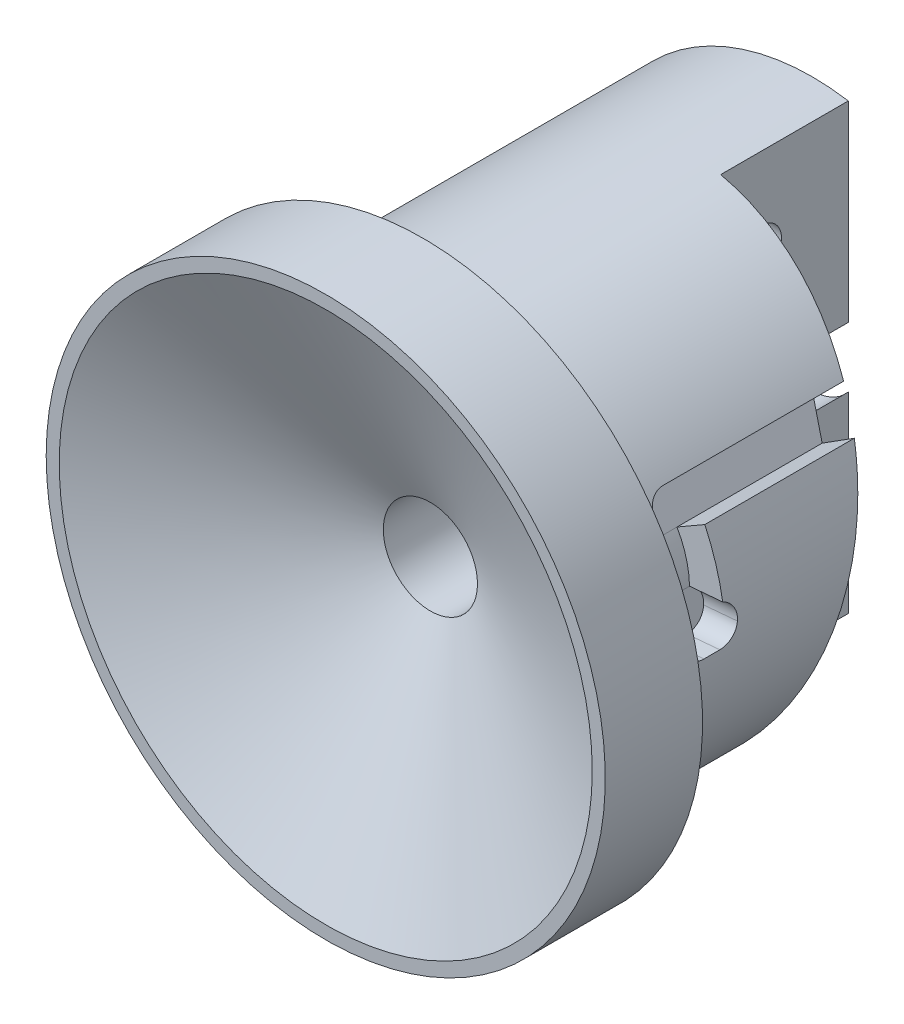
ISO-10303-21;
HEADER;
FILE_DESCRIPTION(('STEP AP214'),'2;1');
FILE_NAME('part.step','',(''),(''),'','','');
FILE_SCHEMA(('AUTOMOTIVE_DESIGN { 1 0 10303 214 1 1 1 1 }'));
ENDSEC;
DATA;
#1=APPLICATION_CONTEXT('core data for automotive mechanical design processes');
#2=APPLICATION_PROTOCOL_DEFINITION('international standard','automotive_design',2000,#1);
#3=PRODUCT_CONTEXT('',#1,'mechanical');
#4=PRODUCT('Part','Part','',(#3));
#5=PRODUCT_RELATED_PRODUCT_CATEGORY('part','',(#4));
#6=PRODUCT_DEFINITION_FORMATION('','',#4);
#7=PRODUCT_DEFINITION_CONTEXT('part definition',#1,'design');
#8=PRODUCT_DEFINITION('design','',#6,#7);
#9=PRODUCT_DEFINITION_SHAPE('','',#8);
#10=(LENGTH_UNIT() NAMED_UNIT(*) SI_UNIT(.MILLI.,.METRE.));
#11=(NAMED_UNIT(*) PLANE_ANGLE_UNIT() SI_UNIT($,.RADIAN.));
#12=(NAMED_UNIT(*) SI_UNIT($,.STERADIAN.) SOLID_ANGLE_UNIT());
#13=UNCERTAINTY_MEASURE_WITH_UNIT(LENGTH_MEASURE(1.E-05),#10,'distance_accuracy_value','');
#14=(GEOMETRIC_REPRESENTATION_CONTEXT(3) GLOBAL_UNCERTAINTY_ASSIGNED_CONTEXT((#13)) GLOBAL_UNIT_ASSIGNED_CONTEXT((#10,
#11,#12)) REPRESENTATION_CONTEXT('',''));
#15=CARTESIAN_POINT('',(0.,0.,0.));
#16=DIRECTION('',(0.,0.,1.));
#17=DIRECTION('',(1.,0.,0.));
#18=AXIS2_PLACEMENT_3D('',#15,#16,#17);
#19=CARTESIAN_POINT('',(12.4163792441114,1.08629242589841,-11.43));
#20=DIRECTION('',(-0.996194698091745,-0.0871557427476648,0.));
#21=DIRECTION('',(0.0871557427476648,-0.996194698091745,0.));
#22=AXIS2_PLACEMENT_3D('',#19,#20,#21);
#23=PLANE('',#22);
#24=DIRECTION('',(0.,0.,1.));
#25=VECTOR('',#24,1.);
#26=CARTESIAN_POINT('',(12.5303876711996,-0.216829858675404,-11.43));
#27=LINE('',#26,#25);
#28=CARTESIAN_POINT('',(12.5303876711996,-0.216829858675404,-11.0477431507776));
#29=VERTEX_POINT('',#28);
#30=CARTESIAN_POINT('',(12.5303876711996,-0.216829858675404,-10.0076));
#31=VERTEX_POINT('',#30);
#32=EDGE_CURVE('E190',#29,#31,#27,.T.);
#33=ORIENTED_EDGE('',*,*,#32,.F.);
#34=CARTESIAN_POINT('',(12.4263411455075,0.972427371906513,-11.0477431507776));
#35=DIRECTION('',(-0.996194698091745,-0.0871557427476648,0.));
#36=DIRECTION('',(0.0871557427476648,-0.996194698091745,0.));
#37=AXIS2_PLACEMENT_3D('',#34,#35,#36);
#38=CIRCLE('',#37,1.1938);
#39=CARTESIAN_POINT('',(12.4417284972035,0.796549137220463,-12.2284160588988));
#40=VERTEX_POINT('',#39);
#41=EDGE_CURVE('E63',#29,#40,#38,.F.);
#42=ORIENTED_EDGE('',*,*,#41,.T.);
#43=CARTESIAN_POINT('',(12.4248678884302,0.989266777355177,-10.9347));
#44=DIRECTION('',(0.996194698091745,0.0871557427476654,0.));
#45=DIRECTION('',(-0.0871557427476654,0.996194698091745,0.));
#46=AXIS2_PLACEMENT_3D('',#43,#44,#45);
#47=CIRCLE('',#46,1.3081);
#48=CARTESIAN_POINT('',(12.3193481056608,2.19536341338579,-11.43));
#49=VERTEX_POINT('',#48);
#50=EDGE_CURVE('E183',#40,#49,#47,.T.);
#51=ORIENTED_EDGE('',*,*,#50,.T.);
#52=DIRECTION('',(0.,0.,-1.));
#53=VECTOR('',#52,1.);
#54=CARTESIAN_POINT('',(12.3193481056608,2.19536341338579,-4.98224669027091));
#55=LINE('',#54,#53);
#56=CARTESIAN_POINT('',(12.3193481056608,2.19536341338579,-8.8138));
#57=VERTEX_POINT('',#56);
#58=EDGE_CURVE('E676',#57,#49,#55,.T.);
#59=ORIENTED_EDGE('',*,*,#58,.F.);
#60=DIRECTION('',(0.0871557427476648,-0.996194698091745,0.));
#61=VECTOR('',#60,1.);
#62=CARTESIAN_POINT('',(12.4163792441114,1.08629242589841,-8.8138));
#63=LINE('',#62,#61);
#64=CARTESIAN_POINT('',(12.4263411455075,0.972427371906522,-8.8138));
#65=VERTEX_POINT('',#64);
#66=EDGE_CURVE('E173',#57,#65,#63,.T.);
#67=ORIENTED_EDGE('',*,*,#66,.T.);
#68=CARTESIAN_POINT('',(12.4263411455075,0.972427371906522,-10.0076));
#69=DIRECTION('',(-0.996194698091745,-0.0871557427476648,0.));
#70=DIRECTION('',(0.0871557427476648,-0.996194698091745,0.));
#71=AXIS2_PLACEMENT_3D('',#68,#69,#70);
#72=CIRCLE('',#71,1.1938);
#73=EDGE_CURVE('E327',#65,#31,#72,.F.);
#74=ORIENTED_EDGE('',*,*,#73,.T.);
#75=EDGE_LOOP('',(#33,#42,#51,#59,#67,#74));
#76=FACE_BOUND('',#75,.T.);
#77=ADVANCED_FACE('F48',(#76),#23,.F.);
#78=CARTESIAN_POINT('',(0.,0.,-0.325495880631441));
#79=DIRECTION('',(0.,0.,-1.));
#80=DIRECTION('',(-1.,0.,0.));
#81=AXIS2_PLACEMENT_3D('',#78,#79,#80);
#82=CYLINDRICAL_SURFACE('',#81,14.6812);
#83=CARTESIAN_POINT('',(0.,0.,-6.35));
#84=DIRECTION('',(0.,0.,-1.));
#85=DIRECTION('',(-1.,0.,0.));
#86=AXIS2_PLACEMENT_3D('',#83,#84,#85);
#87=CIRCLE('',#86,14.6812);
#88=CARTESIAN_POINT('',(-14.6812,0.,-6.35));
#89=VERTEX_POINT('',#88);
#90=EDGE_CURVE('E274',#89,#89,#87,.T.);
#91=ORIENTED_EDGE('',*,*,#90,.T.);
#92=EDGE_LOOP('',(#91));
#93=FACE_BOUND('',#92,.T.);
#94=CARTESIAN_POINT('',(0.,0.,-11.43));
#95=DIRECTION('',(0.,0.,-1.));
#96=DIRECTION('',(-1.,0.,0.));
#97=AXIS2_PLACEMENT_3D('',#94,#95,#96);
#98=CIRCLE('',#97,14.6812);
#99=CARTESIAN_POINT('',(13.3177730257338,6.17855606715985,-11.43));
#100=VERTEX_POINT('',#99);
#101=CARTESIAN_POINT('',(14.4861901964781,2.3849375319831,-11.43));
#102=VERTEX_POINT('',#101);
#103=EDGE_CURVE('E178',#100,#102,#98,.T.);
#104=ORIENTED_EDGE('',*,*,#103,.T.);
#105=CARTESIAN_POINT('',(14.4861901964781,2.3849375319831,-11.43));
#106=CARTESIAN_POINT('',(14.4884613639518,2.37113892146036,-11.4640839324803));
#107=CARTESIAN_POINT('',(14.4909469978515,2.35592163119562,-11.4975599355647));
#108=CARTESIAN_POINT('',(14.4963016066078,2.32274827648895,-11.5630917175754));
#109=CARTESIAN_POINT('',(14.4991705585478,2.30479237576407,-11.5951475812514));
#110=CARTESIAN_POINT('',(14.5082748069592,2.24702314199613,-11.6887851744347));
#111=CARTESIAN_POINT('',(14.5150150036987,2.2032637948891,-11.7479464938295));
#112=CARTESIAN_POINT('',(14.5293750070234,2.10648592639315,-11.8580031221646));
#113=CARTESIAN_POINT('',(14.5369951813185,2.0534635295405,-11.9088949540572));
#114=CARTESIAN_POINT('',(14.5526203993969,1.93963040528132,-12.0009804680014));
#115=CARTESIAN_POINT('',(14.5606253725657,1.87882110346975,-12.0421759213184));
#116=CARTESIAN_POINT('',(14.576537633485,1.75109152865624,-12.1137040439891));
#117=CARTESIAN_POINT('',(14.5844449014716,1.68417004152981,-12.1440345492142));
#118=CARTESIAN_POINT('',(14.5997272511608,1.54609767566489,-12.1929541419579));
#119=CARTESIAN_POINT('',(14.607102277394,1.47494635750507,-12.2115420072372));
#120=CARTESIAN_POINT('',(14.6209501884581,1.33066995216013,-12.2363920347503));
#121=CARTESIAN_POINT('',(14.6274258299262,1.25755175459766,-12.2426926683214));
#122=CARTESIAN_POINT('',(14.6392703996066,1.11120858960278,-12.2429046032492));
#123=CARTESIAN_POINT('',(14.6446393414138,1.03798362349305,-12.2368160568067));
#124=CARTESIAN_POINT('',(14.6541548947385,0.893645242462607,-12.2124528028116));
#125=CARTESIAN_POINT('',(14.6583036793869,0.822528278854515,-12.1941999519649));
#126=CARTESIAN_POINT('',(14.6654071916949,0.684294374417719,-12.1460628447409));
#127=CARTESIAN_POINT('',(14.6683620518004,0.61717699060737,-12.1161798792521));
#128=CARTESIAN_POINT('',(14.6732064954826,0.488666124884252,-12.0455416585469));
#129=CARTESIAN_POINT('',(14.6750933912915,0.427287406482897,-12.0047593487301));
#130=CARTESIAN_POINT('',(14.6779937408499,0.312178358820198,-11.9135124207659));
#131=CARTESIAN_POINT('',(14.6790070080101,0.258449665492134,-11.8630457370473));
#132=CARTESIAN_POINT('',(14.6804218904452,0.159245895251082,-11.7527841678264));
#133=CARTESIAN_POINT('',(14.680811807414,0.113942466276904,-11.692833569748));
#134=CARTESIAN_POINT('',(14.6811136624675,0.0541648994216365,-11.5978162464266));
#135=CARTESIAN_POINT('',(14.6811670302523,0.0355888327049288,-11.5652633572206));
#136=CARTESIAN_POINT('',(14.6812098056202,0.00129355360213024,-11.498683736804));
#137=CARTESIAN_POINT('',(14.6811992098185,-0.014425507549017,-11.4646569276898));
#138=CARTESIAN_POINT('',(14.6811720243797,-0.028660610083196,-11.43));
#139=B_SPLINE_CURVE_WITH_KNOTS('',3,(#105,#106,#107,#108,#109,#110,#111,#112,#113,#114,#115,
#116,#117,#118,#119,#120,#121,#122,#123,#124,#125,#126,#127,#128,#129,#130,#131,#132,#133,#134,
#135,#136,#137,#138),.UNSPECIFIED.,.F.,.F.,(4,2,2,2,2,2,2,2,2,2,2,2,2,2,2,2,4),(0.,
0.110455309405497,0.22090401826105,0.441450437625067,0.662089350884358,0.882687928062333,
1.10333042064266,1.3239958751392,1.5439693094908,1.76394004148966,1.98351659398571,
2.20306878145643,2.42317109112525,2.64332039849976,2.86755466092752,2.97987594788759,
3.09220317881903),.UNSPECIFIED.);
#140=CARTESIAN_POINT('',(14.6478125129356,0.989556479382784,-12.2284160588988));
#141=VERTEX_POINT('',#140);
#142=EDGE_CURVE('E163',#102,#141,#139,.T.);
#143=ORIENTED_EDGE('',*,*,#142,.T.);
#144=CARTESIAN_POINT('',(14.6478125129356,0.989556479382784,-12.2284160588988));
#145=CARTESIAN_POINT('',(14.6500520617752,0.956414885802688,-12.2234497719461));
#146=CARTESIAN_POINT('',(14.6521625740862,0.923490699329103,-12.2170844377252));
#147=CARTESIAN_POINT('',(14.6561266797544,0.858282230564713,-12.2016024279582));
#148=CARTESIAN_POINT('',(14.6579802900503,0.825997906205256,-12.1924859339349));
#149=CARTESIAN_POINT('',(14.6631521672888,0.730511927722907,-12.1611134422584));
#150=CARTESIAN_POINT('',(14.6660889302212,0.668565530487546,-12.1348175692463));
#151=CARTESIAN_POINT('',(14.6710176288004,0.549922268249114,-12.0722187251337));
#152=CARTESIAN_POINT('',(14.6730091760995,0.493227568624937,-12.0359116505367));
#153=CARTESIAN_POINT('',(14.6762031903628,0.38669701296365,-11.9543239944428));
#154=CARTESIAN_POINT('',(14.6774058468479,0.336859511848389,-11.9090455716021));
#155=CARTESIAN_POINT('',(14.6792209558788,0.245374594432259,-11.8106954776694));
#156=CARTESIAN_POINT('',(14.6798323334249,0.203742204744798,-11.7576098133281));
#157=CARTESIAN_POINT('',(14.680671372986,0.129958071030313,-11.6451657160257));
#158=CARTESIAN_POINT('',(14.680898820731,0.0978116293300162,-11.5858037999342));
#159=CARTESIAN_POINT('',(14.6811588607807,0.043971541156054,-11.4625272929247));
#160=CARTESIAN_POINT('',(14.681191469244,0.0222770279981484,-11.3986130799922));
#161=CARTESIAN_POINT('',(14.6812059558936,-0.00998039306510226,-11.268137439148));
#162=CARTESIAN_POINT('',(14.6811879344012,-0.0205652571984908,-11.2015815034751));
#163=CARTESIAN_POINT('',(14.6811735472856,-0.0276040131707234,-11.1057329463568));
#164=CARTESIAN_POINT('',(14.6811706958382,-0.0286684031172335,-11.0767298307041));
#165=CARTESIAN_POINT('',(14.6811720243797,-0.0286606100832027,-11.0477431507776));
#166=B_SPLINE_CURVE_WITH_KNOTS('',3,(#144,#145,#146,#147,#148,#149,#150,#151,#152,#153,#154,
#155,#156,#157,#158,#159,#160,#161,#162,#163,#164,#165),.UNSPECIFIED.,.F.,.F.,(4,2,2,2,2,2,2,2,
2,2,4),(0.,0.100696848378733,0.201387054188759,0.402432056561508,0.603559588185072,
0.804638783804235,1.00608287651422,1.20763935734326,1.40917912203195,1.61031982519953,
1.69730434377564),.UNSPECIFIED.);
#167=CARTESIAN_POINT('',(14.6811720243797,-0.0286606100831969,-11.0477431507776));
#168=VERTEX_POINT('',#167);
#169=EDGE_CURVE('E13',#141,#168,#166,.T.);
#170=ORIENTED_EDGE('',*,*,#169,.T.);
#171=DIRECTION('',(0.,0.,1.));
#172=VECTOR('',#171,1.);
#173=CARTESIAN_POINT('',(14.6811720243797,-0.0286606100831969,-11.43));
#174=LINE('',#173,#172);
#175=CARTESIAN_POINT('',(14.6811720243797,-0.0286606100831969,-10.0076));
#176=VERTEX_POINT('',#175);
#177=EDGE_CURVE('E195',#168,#176,#174,.T.);
#178=ORIENTED_EDGE('',*,*,#177,.T.);
#179=CARTESIAN_POINT('',(14.6811720243797,-0.0286606100831969,-10.0076));
#180=CARTESIAN_POINT('',(14.6811713603819,-0.0286605230438289,-9.97408563546251));
#181=CARTESIAN_POINT('',(14.6811748663989,-0.0272427717737959,-9.94058738885749));
#182=CARTESIAN_POINT('',(14.6811845304353,-0.0215876829205685,-9.8738318693208));
#183=CARTESIAN_POINT('',(14.68119068829,-0.0173505205160749,-9.84057458154739));
#184=CARTESIAN_POINT('',(14.6812045930233,-0.000453664150254155,-9.74159048510479));
#185=CARTESIAN_POINT('',(14.6812078098013,0.0163915308899458,-9.67652869935269));
#186=CARTESIAN_POINT('',(14.6810908383812,0.0607567027563818,-9.55016116036319));
#187=CARTESIAN_POINT('',(14.6809705991541,0.0882810907647501,-9.48885697138397));
#188=CARTESIAN_POINT('',(14.6804363890432,0.153200837694031,-9.37172124193255));
#189=CARTESIAN_POINT('',(14.6800224525708,0.190595039879959,-9.31588906119583));
#190=CARTESIAN_POINT('',(14.6786972688968,0.274281353774743,-9.21113424513901));
#191=CARTESIAN_POINT('',(14.6777848159165,0.320594862330806,-9.16222872618486));
#192=CARTESIAN_POINT('',(14.6752549436024,0.42074894096606,-9.07284954191489));
#193=CARTESIAN_POINT('',(14.6736373854947,0.474590991341006,-9.03237753874161));
#194=CARTESIAN_POINT('',(14.6695155823306,0.588380160054187,-8.96094395595983));
#195=CARTESIAN_POINT('',(14.6670094195741,0.648340280904667,-8.93000321783209));
#196=CARTESIAN_POINT('',(14.6609910764105,0.772547009819359,-8.87865031721457));
#197=CARTESIAN_POINT('',(14.6574795068623,0.836790996991481,-8.85823178273492));
#198=CARTESIAN_POINT('',(14.6507889416689,0.945461627073592,-8.83354305630054));
#199=CARTESIAN_POINT('',(14.6479009496125,0.989221128629121,-8.82614487763141));
#200=CARTESIAN_POINT('',(14.6416949748365,1.07720193868941,-8.81627361018692));
#201=CARTESIAN_POINT('',(14.6383775752617,1.12142254745402,-8.81379391522364));
#202=CARTESIAN_POINT('',(14.6348522499863,1.16564705681955,-8.8138));
#203=B_SPLINE_CURVE_WITH_KNOTS('',3,(#179,#180,#181,#182,#183,#184,#185,#186,#187,#188,#189,
#190,#191,#192,#193,#194,#195,#196,#197,#198,#199,#200,#201,#202),.UNSPECIFIED.,.F.,.F.,(4,2,2,
2,2,2,2,2,2,2,2,4),(0.,0.10048113671173,0.200956030803738,0.401542288075423,0.602211488518851,
0.8028571811141,1.00399034458768,1.20516311152662,1.40677269924674,1.60826005322121,
1.74142420625145,1.87440938039694),.UNSPECIFIED.);
#204=CARTESIAN_POINT('',(14.6348522499863,1.16564705681955,-8.8138));
#205=VERTEX_POINT('',#204);
#206=EDGE_CURVE('E339',#176,#205,#203,.T.);
#207=ORIENTED_EDGE('',*,*,#206,.T.);
#208=CARTESIAN_POINT('',(0.,0.,-8.8138));
#209=DIRECTION('',(0.,0.,-1.));
#210=DIRECTION('',(-1.,0.,0.));
#211=AXIS2_PLACEMENT_3D('',#208,#209,#210);
#212=CIRCLE('',#211,14.6812);
#213=CARTESIAN_POINT('',(12.6567568233372,7.43936423055812,-8.8138));
#214=VERTEX_POINT('',#213);
#215=EDGE_CURVE('E209',#205,#214,#212,.F.);
#216=ORIENTED_EDGE('',*,*,#215,.T.);
#217=CARTESIAN_POINT('',(12.6567568233372,7.43936423055812,-8.8138));
#218=CARTESIAN_POINT('',(12.6397597788737,7.46828295212252,-8.81380015810687));
#219=CARTESIAN_POINT('',(12.6226705774063,7.49712876306233,-8.8152145949507));
#220=CARTESIAN_POINT('',(12.5884195945533,7.55449792981282,-8.82085647503839));
#221=CARTESIAN_POINT('',(12.5712578177808,7.58302130570696,-8.82508374208702));
#222=CARTESIAN_POINT('',(12.5198894231226,7.66774696235313,-8.84194156904666));
#223=CARTESIAN_POINT('',(12.4857380361821,7.72320965707814,-8.8587482841184));
#224=CARTESIAN_POINT('',(12.4187154652752,7.83052717895543,-8.90302146476721));
#225=CARTESIAN_POINT('',(12.3858448136072,7.88238051288315,-8.93049231164126));
#226=CARTESIAN_POINT('',(12.322454656725,7.98111440689049,-8.99530765608452));
#227=CARTESIAN_POINT('',(12.2919348705147,8.02799556154164,-9.03265097123783));
#228=CARTESIAN_POINT('',(12.2342228425561,8.11567569488978,-9.11625205562751));
#229=CARTESIAN_POINT('',(12.2070382409144,8.15646075385226,-9.16252968986431));
#230=CARTESIAN_POINT('',(12.1570375594092,8.23080088923721,-9.26265484131266));
#231=CARTESIAN_POINT('',(12.1342223196209,8.26435457547542,-9.31650381078207));
#232=CARTESIAN_POINT('',(12.0937823150095,8.32342180353166,-9.43031977384777));
#233=CARTESIAN_POINT('',(12.0761645636817,8.34892448453775,-9.49029488857362));
#234=CARTESIAN_POINT('',(12.0468408632733,8.39118133972652,-9.61459598954198));
#235=CARTESIAN_POINT('',(12.0351312922353,8.40794087403206,-9.6789192826759));
#236=CARTESIAN_POINT('',(12.0209857473769,8.4281451550881,-9.7876294569824));
#237=CARTESIAN_POINT('',(12.0167485960115,8.43418213385462,-9.83132608869502));
#238=CARTESIAN_POINT('',(12.0110913581152,8.44223457874028,-9.91920886554014));
#239=CARTESIAN_POINT('',(12.0096674778834,8.44425546059445,-9.96339427054197));
#240=CARTESIAN_POINT('',(12.0096730257338,8.4442517285407,-10.0076));
#241=B_SPLINE_CURVE_WITH_KNOTS('',3,(#217,#218,#219,#220,#221,#222,#223,#224,#225,#226,#227,
#228,#229,#230,#231,#232,#233,#234,#235,#236,#237,#238,#239,#240),.UNSPECIFIED.,.F.,.F.,(4,2,2,
2,2,2,2,2,2,2,2,4),(0.,0.100569590039991,0.201132881010322,0.401899054356789,0.60274779877107,
0.80357249861645,1.00484897434578,1.20616410971808,1.40774967022183,1.6092114998785,
1.74189925108982,1.87440795018741),.UNSPECIFIED.);
#242=CARTESIAN_POINT('',(12.0096730257338,8.4442517285407,-10.0076));
#243=VERTEX_POINT('',#242);
#244=EDGE_CURVE('E331',#214,#243,#241,.T.);
#245=ORIENTED_EDGE('',*,*,#244,.T.);
#246=DIRECTION('',(0.,0.,-1.));
#247=VECTOR('',#246,1.);
#248=CARTESIAN_POINT('',(12.0096730257338,8.4442517285407,-1.79195968761566));
#249=LINE('',#248,#247);
#250=CARTESIAN_POINT('',(12.0096730257338,8.4442517285407,-21.7988693357249));
#251=VERTEX_POINT('',#250);
#252=EDGE_CURVE('E210',#243,#251,#249,.T.);
#253=ORIENTED_EDGE('',*,*,#252,.T.);
#254=CARTESIAN_POINT('',(0.,0.,-19.5362389043773));
#255=DIRECTION('',(0.,0.258819045102521,0.965925826289068));
#256=DIRECTION('',(0.,0.965925826289068,-0.258819045102521));
#257=AXIS2_PLACEMENT_3D('',#254,#255,#256);
#258=ELLIPSE('',#257,15.1990966598365,14.6812);
#259=CARTESIAN_POINT('',(2.3622,14.4899152723541,-23.4188));
#260=VERTEX_POINT('',#259);
#261=EDGE_CURVE('E290',#260,#251,#258,.F.);
#262=ORIENTED_EDGE('',*,*,#261,.F.);
#263=DIRECTION('',(0.,0.,-1.));
#264=VECTOR('',#263,1.);
#265=CARTESIAN_POINT('',(2.3622,14.4899152723541,-23.4188));
#266=LINE('',#265,#264);
#267=CARTESIAN_POINT('',(2.3622,14.4899152723541,-31.75));
#268=VERTEX_POINT('',#267);
#269=EDGE_CURVE('E241',#260,#268,#266,.T.);
#270=ORIENTED_EDGE('',*,*,#269,.T.);
#271=CARTESIAN_POINT('',(0.,0.,-31.75));
#272=DIRECTION('',(0.,0.,-1.));
#273=DIRECTION('',(-1.,0.,0.));
#274=AXIS2_PLACEMENT_3D('',#271,#272,#273);
#275=CIRCLE('',#274,14.6812);
#276=CARTESIAN_POINT('',(2.3622,-14.4899152723541,-31.75));
#277=VERTEX_POINT('',#276);
#278=EDGE_CURVE('E278',#277,#268,#275,.T.);
#279=ORIENTED_EDGE('',*,*,#278,.F.);
#280=DIRECTION('',(0.,0.,1.));
#281=VECTOR('',#280,1.);
#282=CARTESIAN_POINT('',(2.3622,-14.4899152723541,-31.75));
#283=LINE('',#282,#281);
#284=CARTESIAN_POINT('',(2.3622,-14.4899152723541,-15.6536778087546));
#285=VERTEX_POINT('',#284);
#286=EDGE_CURVE('E232',#277,#285,#283,.T.);
#287=ORIENTED_EDGE('',*,*,#286,.T.);
#288=CARTESIAN_POINT('',(13.3177730257338,6.17855606715985,-21.1917780129632));
#289=VERTEX_POINT('',#288);
#290=EDGE_CURVE('E286',#289,#285,#258,.F.);
#291=ORIENTED_EDGE('',*,*,#290,.F.);
#292=DIRECTION('',(0.,0.,-1.));
#293=VECTOR('',#292,1.);
#294=CARTESIAN_POINT('',(13.3177730257338,6.17855606715985,-1.79195968761566));
#295=LINE('',#294,#293);
#296=EDGE_CURVE('E188',#100,#289,#295,.T.);
#297=ORIENTED_EDGE('',*,*,#296,.F.);
#298=EDGE_LOOP('',(#104,#143,#170,#178,#207,#216,#245,#253,#262,#270,#279,#287,#291,#297));
#299=FACE_BOUND('',#298,.T.);
#300=ADVANCED_FACE('F186',(#93,#299),#82,.T.);
#301=CARTESIAN_POINT('',(0.,0.,-11.43));
#302=DIRECTION('',(0.,0.,-1.));
#303=DIRECTION('',(-1.,0.,0.));
#304=AXIS2_PLACEMENT_3D('',#301,#302,#303);
#305=PLANE('',#304);
#306=CARTESIAN_POINT('',(6.18343536424458,2.05954429780938,-11.43));
#307=DIRECTION('',(0.,0.,1.));
#308=DIRECTION('',(1.,0.,0.));
#309=AXIS2_PLACEMENT_3D('',#306,#307,#308);
#310=CIRCLE('',#309,6.13741574300042);
#311=CARTESIAN_POINT('',(11.4985933112695,5.12825216930959,-11.43));
#312=VERTEX_POINT('',#311);
#313=EDGE_CURVE('E181',#49,#312,#310,.T.);
#314=ORIENTED_EDGE('',*,*,#313,.F.);
#315=DIRECTION('',(-0.996194698091745,-0.0871557427476654,0.));
#316=VECTOR('',#315,1.);
#317=CARTESIAN_POINT('',(19.5987713062001,2.8322304204406,-11.43));
#318=LINE('',#317,#316);
#319=EDGE_CURVE('E167',#102,#49,#318,.T.);
#320=ORIENTED_EDGE('',*,*,#319,.F.);
#321=ORIENTED_EDGE('',*,*,#103,.F.);
#322=DIRECTION('',(0.866025403784438,0.500000000000001,0.));
#323=VECTOR('',#322,1.);
#324=CARTESIAN_POINT('',(13.3177730257338,6.17855606715985,-11.43));
#325=LINE('',#324,#323);
#326=EDGE_CURVE('E306',#312,#100,#325,.T.);
#327=ORIENTED_EDGE('',*,*,#326,.F.);
#328=EDGE_LOOP('',(#314,#320,#321,#327));
#329=FACE_BOUND('',#328,.T.);
#330=ADVANCED_FACE('F177',(#329),#305,.F.);
#331=CARTESIAN_POINT('',(0.,0.,-0.325495880631441));
#332=DIRECTION('',(0.,0.,-1.));
#333=DIRECTION('',(-1.,0.,0.));
#334=AXIS2_PLACEMENT_3D('',#331,#332,#333);
#335=CYLINDRICAL_SURFACE('',#334,3.0734);
#336=CARTESIAN_POINT('',(0.,0.,-6.83237010218978));
#337=DIRECTION('',(0.,0.,1.));
#338=DIRECTION('',(1.,0.,0.));
#339=AXIS2_PLACEMENT_3D('',#336,#337,#338);
#340=CIRCLE('',#339,3.0734);
#341=CARTESIAN_POINT('',(3.0734,0.,-6.83237010218978));
#342=VERTEX_POINT('',#341);
#343=EDGE_CURVE('E265',#342,#342,#340,.F.);
#344=ORIENTED_EDGE('',*,*,#343,.F.);
#345=EDGE_LOOP('',(#344));
#346=FACE_BOUND('',#345,.T.);
#347=CARTESIAN_POINT('',(0.,0.,-19.5362389043773));
#348=DIRECTION('',(0.,0.258819045102521,0.965925826289068));
#349=DIRECTION('',(0.,0.965925826289068,-0.258819045102521));
#350=AXIS2_PLACEMENT_3D('',#347,#348,#349);
#351=ELLIPSE('',#350,3.18181781287235,3.0734);
#352=CARTESIAN_POINT('',(2.3622,-1.96616345200494,-19.009406995225));
#353=VERTEX_POINT('',#352);
#354=CARTESIAN_POINT('',(2.3622,1.96616345200494,-20.0630708135296));
#355=VERTEX_POINT('',#354);
#356=EDGE_CURVE('E258',#353,#355,#351,.T.);
#357=ORIENTED_EDGE('',*,*,#356,.F.);
#358=DIRECTION('',(0.,0.,-1.));
#359=VECTOR('',#358,1.);
#360=CARTESIAN_POINT('',(2.3622,-1.96616345200494,-0.325495880631441));
#361=LINE('',#360,#359);
#362=CARTESIAN_POINT('',(2.3622,-1.96616345200494,-31.75));
#363=VERTEX_POINT('',#362);
#364=EDGE_CURVE('E254',#353,#363,#361,.T.);
#365=ORIENTED_EDGE('',*,*,#364,.T.);
#366=CARTESIAN_POINT('',(0.,0.,-31.75));
#367=DIRECTION('',(0.,0.,-1.));
#368=DIRECTION('',(-1.,0.,0.));
#369=AXIS2_PLACEMENT_3D('',#366,#367,#368);
#370=CIRCLE('',#369,3.0734);
#371=CARTESIAN_POINT('',(2.3622,1.96616345200495,-31.75));
#372=VERTEX_POINT('',#371);
#373=EDGE_CURVE('E282',#363,#372,#370,.T.);
#374=ORIENTED_EDGE('',*,*,#373,.T.);
#375=DIRECTION('',(0.,0.,-1.));
#376=VECTOR('',#375,1.);
#377=CARTESIAN_POINT('',(2.3622,1.96616345200494,-0.325495880631441));
#378=LINE('',#377,#376);
#379=EDGE_CURVE('E250',#372,#355,#378,.F.);
#380=ORIENTED_EDGE('',*,*,#379,.T.);
#381=EDGE_LOOP('',(#357,#365,#374,#380));
#382=FACE_BOUND('',#381,.T.);
#383=ADVANCED_FACE('F362',(#346,#382),#335,.F.);
#384=CARTESIAN_POINT('',(0.,3.0734,-31.75));
#385=DIRECTION('',(0.,0.,-1.));
#386=DIRECTION('',(-1.,0.,0.));
#387=AXIS2_PLACEMENT_3D('',#384,#385,#386);
#388=PLANE('',#387);
#389=ORIENTED_EDGE('',*,*,#278,.T.);
#390=DIRECTION('',(0.,-1.,0.));
#391=VECTOR('',#390,1.);
#392=CARTESIAN_POINT('',(2.3622,14.4899152723541,-31.75));
#393=LINE('',#392,#391);
#394=EDGE_CURVE('E246',#268,#372,#393,.T.);
#395=ORIENTED_EDGE('',*,*,#394,.T.);
#396=ORIENTED_EDGE('',*,*,#373,.F.);
#397=EDGE_CURVE('E245',#363,#277,#393,.T.);
#398=ORIENTED_EDGE('',*,*,#397,.T.);
#399=EDGE_LOOP('',(#389,#395,#396,#398));
#400=FACE_BOUND('',#399,.T.);
#401=ADVANCED_FACE('F355',(#400),#388,.T.);
#402=CARTESIAN_POINT('',(0.,18.2499,0.));
#403=DIRECTION('',(0.,0.,1.));
#404=DIRECTION('',(1.,0.,0.));
#405=AXIS2_PLACEMENT_3D('',#402,#403,#404);
#406=PLANE('',#405);
#407=CARTESIAN_POINT('',(0.,0.,0.));
#408=DIRECTION('',(0.,0.,-1.));
#409=DIRECTION('',(-1.,0.,0.));
#410=AXIS2_PLACEMENT_3D('',#407,#408,#409);
#411=CIRCLE('',#410,17.399);
#412=CARTESIAN_POINT('',(17.399,0.,0.));
#413=VERTEX_POINT('',#412);
#414=EDGE_CURVE('E261',#413,#413,#411,.T.);
#415=ORIENTED_EDGE('',*,*,#414,.T.);
#416=EDGE_LOOP('',(#415));
#417=FACE_BOUND('',#416,.T.);
#418=CARTESIAN_POINT('',(0.,0.,0.));
#419=DIRECTION('',(0.,0.,-1.));
#420=DIRECTION('',(-1.,0.,0.));
#421=AXIS2_PLACEMENT_3D('',#418,#419,#420);
#422=CIRCLE('',#421,18.2499);
#423=CARTESIAN_POINT('',(-18.2499,0.,0.));
#424=VERTEX_POINT('',#423);
#425=EDGE_CURVE('E266',#424,#424,#422,.T.);
#426=ORIENTED_EDGE('',*,*,#425,.F.);
#427=EDGE_LOOP('',(#426));
#428=FACE_BOUND('',#427,.T.);
#429=ADVANCED_FACE('F361',(#417,#428),#406,.T.);
#430=CARTESIAN_POINT('',(0.,14.6812,-6.35));
#431=DIRECTION('',(0.,0.,-1.));
#432=DIRECTION('',(-1.,0.,0.));
#433=AXIS2_PLACEMENT_3D('',#430,#431,#432);
#434=PLANE('',#433);
#435=CARTESIAN_POINT('',(0.,0.,-6.35));
#436=DIRECTION('',(0.,0.,-1.));
#437=DIRECTION('',(-1.,0.,0.));
#438=AXIS2_PLACEMENT_3D('',#435,#436,#437);
#439=CIRCLE('',#438,18.2499);
#440=CARTESIAN_POINT('',(-18.2499,0.,-6.35));
#441=VERTEX_POINT('',#440);
#442=EDGE_CURVE('E270',#441,#441,#439,.T.);
#443=ORIENTED_EDGE('',*,*,#442,.T.);
#444=EDGE_LOOP('',(#443));
#445=FACE_BOUND('',#444,.T.);
#446=ORIENTED_EDGE('',*,*,#90,.F.);
#447=EDGE_LOOP('',(#446));
#448=FACE_BOUND('',#447,.T.);
#449=ADVANCED_FACE('F353',(#445,#448),#434,.T.);
#450=CARTESIAN_POINT('',(0.,0.,-0.325495880631441));
#451=DIRECTION('',(0.,0.,-1.));
#452=DIRECTION('',(-1.,0.,0.));
#453=AXIS2_PLACEMENT_3D('',#450,#451,#452);
#454=CYLINDRICAL_SURFACE('',#453,18.2499);
#455=ORIENTED_EDGE('',*,*,#425,.T.);
#456=EDGE_LOOP('',(#455));
#457=FACE_BOUND('',#456,.T.);
#458=ORIENTED_EDGE('',*,*,#442,.F.);
#459=EDGE_LOOP('',(#458));
#460=FACE_BOUND('',#459,.T.);
#461=ADVANCED_FACE('F371',(#457,#460),#454,.T.);
#462=CARTESIAN_POINT('',(0.,0.,-8.29818));
#463=DIRECTION('',(0.,0.,1.));
#464=DIRECTION('',(1.,0.,0.));
#465=AXIS2_PLACEMENT_3D('',#462,#463,#464);
#466=CONICAL_SURFACE('',#465,0.,1.12577095336052);
#467=CARTESIAN_POINT('',(3.0734,0.,-6.83237010218978));
#468=CARTESIAN_POINT('',(3.222625,0.,-6.76119958029197));
#469=CARTESIAN_POINT('',(3.37185,0.,-6.69002905839416));
#470=CARTESIAN_POINT('',(3.6703,0.,-6.54768801459854));
#471=CARTESIAN_POINT('',(3.819525,0.,-6.47651749270073));
#472=CARTESIAN_POINT('',(4.117975,0.,-6.33417644890511));
#473=CARTESIAN_POINT('',(4.2672,0.,-6.2630059270073));
#474=CARTESIAN_POINT('',(4.56565,0.,-6.12066488321168));
#475=CARTESIAN_POINT('',(4.714875,0.,-6.04949436131387));
#476=CARTESIAN_POINT('',(5.013325,0.,-5.90715331751825));
#477=CARTESIAN_POINT('',(5.16255,0.,-5.83598279562044));
#478=CARTESIAN_POINT('',(5.461,0.,-5.69364175182482));
#479=CARTESIAN_POINT('',(5.610225,0.,-5.62247122992701));
#480=CARTESIAN_POINT('',(5.908675,0.,-5.48013018613139));
#481=CARTESIAN_POINT('',(6.0579,0.,-5.40895966423358));
#482=CARTESIAN_POINT('',(6.35635,0.,-5.26661862043796));
#483=CARTESIAN_POINT('',(6.505575,0.,-5.19544809854015));
#484=CARTESIAN_POINT('',(6.804025,0.,-5.05310705474453));
#485=CARTESIAN_POINT('',(6.95325,0.,-4.98193653284671));
#486=CARTESIAN_POINT('',(7.2517,0.,-4.83959548905109));
#487=CARTESIAN_POINT('',(7.400925,0.,-4.76842496715329));
#488=CARTESIAN_POINT('',(7.699375,0.,-4.62608392335766));
#489=CARTESIAN_POINT('',(7.8486,0.,-4.55491340145985));
#490=CARTESIAN_POINT('',(8.14705,0.,-4.41257235766423));
#491=CARTESIAN_POINT('',(8.296275,0.,-4.34140183576642));
#492=CARTESIAN_POINT('',(8.594725,0.,-4.1990607919708));
#493=CARTESIAN_POINT('',(8.74395,0.,-4.12789027007299));
#494=CARTESIAN_POINT('',(9.0424,0.,-3.98554922627737));
#495=CARTESIAN_POINT('',(9.191625,0.,-3.91437870437956));
#496=CARTESIAN_POINT('',(9.490075,0.,-3.77203766058394));
#497=CARTESIAN_POINT('',(9.6393,0.,-3.70086713868613));
#498=CARTESIAN_POINT('',(9.93775,0.,-3.55852609489051));
#499=CARTESIAN_POINT('',(10.086975,0.,-3.4873555729927));
#500=CARTESIAN_POINT('',(10.385425,0.,-3.34501452919708));
#501=CARTESIAN_POINT('',(10.53465,0.,-3.27384400729927));
#502=CARTESIAN_POINT('',(10.8331,0.,-3.13150296350365));
#503=CARTESIAN_POINT('',(10.982325,0.,-3.06033244160584));
#504=CARTESIAN_POINT('',(11.280775,0.,-2.91799139781022));
#505=CARTESIAN_POINT('',(11.43,0.,-2.84682087591241));
#506=CARTESIAN_POINT('',(11.72845,0.,-2.70447983211679));
#507=CARTESIAN_POINT('',(11.877675,0.,-2.63330931021898));
#508=CARTESIAN_POINT('',(12.176125,0.,-2.49096826642336));
#509=CARTESIAN_POINT('',(12.32535,0.,-2.41979774452555));
#510=CARTESIAN_POINT('',(12.6238,0.,-2.27745670072993));
#511=CARTESIAN_POINT('',(12.773025,0.,-2.20628617883212));
#512=CARTESIAN_POINT('',(13.071475,0.,-2.0639451350365));
#513=CARTESIAN_POINT('',(13.2207,0.,-1.99277461313869));
#514=CARTESIAN_POINT('',(13.51915,0.,-1.85043356934307));
#515=CARTESIAN_POINT('',(13.668375,0.,-1.77926304744526));
#516=CARTESIAN_POINT('',(13.966825,0.,-1.63692200364964));
#517=CARTESIAN_POINT('',(14.11605,0.,-1.56575148175182));
#518=CARTESIAN_POINT('',(14.4145,0.,-1.4234104379562));
#519=CARTESIAN_POINT('',(14.563725,0.,-1.35223991605839));
#520=CARTESIAN_POINT('',(14.862175,0.,-1.20989887226277));
#521=CARTESIAN_POINT('',(15.0114,0.,-1.13872835036496));
#522=CARTESIAN_POINT('',(15.30985,0.,-0.996387306569343));
#523=CARTESIAN_POINT('',(15.459075,0.,-0.925216784671533));
#524=CARTESIAN_POINT('',(15.757525,0.,-0.782875740875913));
#525=CARTESIAN_POINT('',(15.90675,0.,-0.711705218978103));
#526=CARTESIAN_POINT('',(16.2052,0.,-0.569364175182482));
#527=CARTESIAN_POINT('',(16.354425,0.,-0.498193653284672));
#528=CARTESIAN_POINT('',(16.652875,0.,-0.355852609489052));
#529=CARTESIAN_POINT('',(16.8021,0.,-0.284682087591241));
#530=CARTESIAN_POINT('',(17.10055,0.,-0.142341043795621));
#531=CARTESIAN_POINT('',(17.249775,0.,-0.0711705218978102));
#532=CARTESIAN_POINT('',(17.399,0.,0.));
#533=B_SPLINE_CURVE_WITH_KNOTS('',3,(#467,#468,#469,#470,#471,#472,#473,#474,#475,#476,#477,
#478,#479,#480,#481,#482,#483,#484,#485,#486,#487,#488,#489,#490,#491,#492,#493,#494,#495,#496,
#497,#498,#499,#500,#501,#502,#503,#504,#505,#506,#507,#508,#509,#510,#511,#512,#513,#514,#515,
#516,#517,#518,#519,#520,#521,#522,#523,#524,#525,#526,#527,#528,#529,#530,#531,#532),
.UNSPECIFIED.,.F.,.F.,(4,2,2,2,2,2,2,2,2,2,2,2,2,2,2,2,2,2,2,2,2,2,2,2,2,2,2,2,2,2,2,2,4),(0.,
0.495983965778996,0.991967931557992,1.48795189733699,1.98393586311598,2.47991982889498,
2.97590379467397,3.47188776045297,3.96787172623197,4.46385569201096,4.95983965778996,
5.45582362356895,5.95180758934795,6.44779155512695,6.94377552090594,7.43975948668494,
7.93574345246393,8.43172741824293,8.92771138402193,9.42369534980092,9.91967931557992,
10.4156632813589,10.9116472471379,11.4076312129169,11.9036151786959,12.3995991444749,
12.8955831102539,13.3915670760329,13.8875510418119,14.3835350075909,14.8795189733699,
15.3755029391489,15.8714869049279),.UNSPECIFIED.);
#534=EDGE_CURVE('BSEAM417',#342,#413,#533,.T.);
#535=ORIENTED_EDGE('',*,*,#343,.T.);
#536=ORIENTED_EDGE('',*,*,#414,.F.);
#537=ORIENTED_EDGE('',*,*,#534,.T.);
#538=ORIENTED_EDGE('',*,*,#534,.F.);
#539=EDGE_LOOP('',(#535,#537,#536,#538));
#540=FACE_BOUND('',#539,.T.);
#541=ADVANCED_FACE('F417',(#540),#466,.F.);
#542=CARTESIAN_POINT('',(2.3622,0.,0.));
#543=DIRECTION('',(1.,0.,0.));
#544=DIRECTION('',(0.,0.,-1.));
#545=AXIS2_PLACEMENT_3D('',#542,#543,#544);
#546=PLANE('',#545);
#547=DIRECTION('',(0.,0.965925826289068,-0.258819045102521));
#548=VECTOR('',#547,1.);
#549=CARTESIAN_POINT('',(2.3622,14.4899152723541,-23.4188));
#550=LINE('',#549,#548);
#551=EDGE_CURVE('E237',#285,#353,#550,.T.);
#552=ORIENTED_EDGE('',*,*,#551,.F.);
#553=ORIENTED_EDGE('',*,*,#286,.F.);
#554=ORIENTED_EDGE('',*,*,#397,.F.);
#555=ORIENTED_EDGE('',*,*,#364,.F.);
#556=EDGE_LOOP('',(#552,#553,#554,#555));
#557=FACE_BOUND('',#556,.T.);
#558=ADVANCED_FACE('F413',(#557),#546,.T.);
#559=CARTESIAN_POINT('',(18.2499,14.4899152723541,-23.4188));
#560=DIRECTION('',(0.,0.258819045102521,0.965925826289068));
#561=DIRECTION('',(0.,-0.965925826289068,0.258819045102521));
#562=AXIS2_PLACEMENT_3D('',#559,#560,#561);
#563=PLANE('',#562);
#564=ORIENTED_EDGE('',*,*,#261,.T.);
#565=DIRECTION('',(-0.858356263574048,-0.49557221983508,0.132788176096109));
#566=VECTOR('',#565,1.);
#567=CARTESIAN_POINT('',(19.3636475675127,12.6900709098504,-22.9365331565654));
#568=LINE('',#567,#566);
#569=CARTESIAN_POINT('',(10.1904933112695,7.39394783069043,-21.5174412544887));
#570=VERTEX_POINT('',#569);
#571=EDGE_CURVE('E302',#251,#570,#568,.T.);
#572=ORIENTED_EDGE('',*,*,#571,.T.);
#573=DIRECTION('',(0.487058473848149,-0.84361002296195,0.226044624379456));
#574=VECTOR('',#573,1.);
#575=CARTESIAN_POINT('',(8.97741629140127,9.49505886259644,-22.080432258696));
#576=LINE('',#575,#574);
#577=CARTESIAN_POINT('',(11.4985933112695,5.12825216930959,-20.910349931727));
#578=VERTEX_POINT('',#577);
#579=EDGE_CURVE('E298',#570,#578,#576,.T.);
#580=ORIENTED_EDGE('',*,*,#579,.T.);
#581=DIRECTION('',(0.858356263574048,0.495572219835079,-0.132788176096109));
#582=VECTOR('',#581,1.);
#583=CARTESIAN_POINT('',(20.7409435709883,10.4643255797031,-22.3401464927951));
#584=LINE('',#583,#582);
#585=EDGE_CURVE('E294',#578,#289,#584,.T.);
#586=ORIENTED_EDGE('',*,*,#585,.T.);
#587=ORIENTED_EDGE('',*,*,#290,.T.);
#588=ORIENTED_EDGE('',*,*,#551,.T.);
#589=ORIENTED_EDGE('',*,*,#356,.T.);
#590=EDGE_CURVE('E236',#355,#260,#550,.T.);
#591=ORIENTED_EDGE('',*,*,#590,.T.);
#592=EDGE_LOOP('',(#564,#572,#580,#586,#587,#588,#589,#591));
#593=FACE_BOUND('',#592,.T.);
#594=ADVANCED_FACE('F411',(#593),#563,.F.);
#595=CARTESIAN_POINT('',(2.3622,8.9408,-26.0340973813224));
#596=DIRECTION('',(1.,0.,0.));
#597=DIRECTION('',(0.,0.,-1.));
#598=AXIS2_PLACEMENT_3D('',#595,#596,#597);
#599=CIRCLE('',#598,1.35255);
#600=CARTESIAN_POINT('',(2.3622,8.9408,-27.3866473813224));
#601=VERTEX_POINT('',#600);
#602=EDGE_CURVE('E214',#601,#601,#599,.T.);
#603=ORIENTED_EDGE('',*,*,#602,.F.);
#604=EDGE_LOOP('',(#603));
#605=FACE_BOUND('',#604,.T.);
#606=ORIENTED_EDGE('',*,*,#394,.F.);
#607=ORIENTED_EDGE('',*,*,#269,.F.);
#608=ORIENTED_EDGE('',*,*,#590,.F.);
#609=ORIENTED_EDGE('',*,*,#379,.F.);
#610=EDGE_LOOP('',(#606,#607,#608,#609));
#611=FACE_BOUND('',#610,.T.);
#612=ADVANCED_FACE('F407',(#605,#611),#546,.T.);
#613=CARTESIAN_POINT('',(-8.6106,8.9408,-26.0340973813224));
#614=DIRECTION('',(1.,0.,0.));
#615=DIRECTION('',(0.,0.,-1.));
#616=AXIS2_PLACEMENT_3D('',#613,#614,#615);
#617=CONICAL_SURFACE('',#616,1.35255,1.02974425867665);
#618=CARTESIAN_POINT('',(-9.42329403026573,8.9408,-26.0340973813224));
#619=VERTEX_POINT('',#618);
#620=VERTEX_LOOP('',#619);
#621=FACE_BOUND('',#620,.T.);
#622=CARTESIAN_POINT('',(-8.6106,8.9408,-26.0340973813224));
#623=DIRECTION('',(1.,0.,0.));
#624=DIRECTION('',(0.,0.,-1.));
#625=AXIS2_PLACEMENT_3D('',#622,#623,#624);
#626=CIRCLE('',#625,1.35255);
#627=CARTESIAN_POINT('',(-8.6106,8.9408,-27.3866473813224));
#628=VERTEX_POINT('',#627);
#629=EDGE_CURVE('E228',#628,#628,#626,.T.);
#630=ORIENTED_EDGE('',*,*,#629,.T.);
#631=EDGE_LOOP('',(#630));
#632=FACE_BOUND('',#631,.T.);
#633=ADVANCED_FACE('F403',(#621,#632),#617,.F.);
#634=CARTESIAN_POINT('',(2.3622,8.9408,-26.0340973813224));
#635=DIRECTION('',(1.,0.,0.));
#636=DIRECTION('',(0.,0.,-1.));
#637=AXIS2_PLACEMENT_3D('',#634,#635,#636);
#638=CYLINDRICAL_SURFACE('',#637,1.35255);
#639=ORIENTED_EDGE('',*,*,#629,.F.);
#640=EDGE_LOOP('',(#639));
#641=FACE_BOUND('',#640,.T.);
#642=ORIENTED_EDGE('',*,*,#602,.T.);
#643=EDGE_LOOP('',(#642));
#644=FACE_BOUND('',#643,.T.);
#645=ADVANCED_FACE('F393',(#641,#644),#638,.F.);
#646=CARTESIAN_POINT('',(10.1904933112695,7.39394783069043,-1.79195968761566));
#647=DIRECTION('',(-0.500000000000001,0.866025403784438,0.));
#648=DIRECTION('',(-0.866025403784438,-0.500000000000001,0.));
#649=AXIS2_PLACEMENT_3D('',#646,#647,#648);
#650=PLANE('',#649);
#651=ORIENTED_EDGE('',*,*,#252,.F.);
#652=DIRECTION('',(-0.866025403784438,-0.500000000000001,0.));
#653=VECTOR('',#652,1.);
#654=CARTESIAN_POINT('',(10.1904933112695,7.39394783069043,-10.0076));
#655=LINE('',#654,#653);
#656=CARTESIAN_POINT('',(10.1904933112695,7.39394783069043,-10.0076));
#657=VERTEX_POINT('',#656);
#658=EDGE_CURVE('E309',#243,#657,#655,.T.);
#659=ORIENTED_EDGE('',*,*,#658,.T.);
#660=DIRECTION('',(0.,0.,-1.));
#661=VECTOR('',#660,1.);
#662=CARTESIAN_POINT('',(10.1904933112695,7.39394783069043,-1.79195968761566));
#663=LINE('',#662,#661);
#664=EDGE_CURVE('E217',#657,#570,#663,.T.);
#665=ORIENTED_EDGE('',*,*,#664,.T.);
#666=ORIENTED_EDGE('',*,*,#571,.F.);
#667=EDGE_LOOP('',(#651,#659,#665,#666));
#668=FACE_BOUND('',#667,.T.);
#669=ADVANCED_FACE('F389',(#668),#650,.F.);
#670=CARTESIAN_POINT('',(11.4985933112695,5.12825216930959,-1.79195968761566));
#671=DIRECTION('',(-0.866025403784438,-0.500000000000001,0.));
#672=DIRECTION('',(0.500000000000001,-0.866025403784438,0.));
#673=AXIS2_PLACEMENT_3D('',#670,#671,#672);
#674=PLANE('',#673);
#675=DIRECTION('',(0.,0.,-1.));
#676=VECTOR('',#675,1.);
#677=CARTESIAN_POINT('',(11.4985933112695,5.12825216930959,-4.98224669027091));
#678=LINE('',#677,#676);
#679=CARTESIAN_POINT('',(11.4985933112695,5.12825216930959,-8.8138));
#680=VERTEX_POINT('',#679);
#681=EDGE_CURVE('E681',#680,#312,#678,.T.);
#682=ORIENTED_EDGE('',*,*,#681,.T.);
#683=DIRECTION('',(0.,0.,-1.));
#684=VECTOR('',#683,1.);
#685=CARTESIAN_POINT('',(11.4985933112695,5.12825216930959,-1.79195968761566));
#686=LINE('',#685,#684);
#687=EDGE_CURVE('E220',#312,#578,#686,.T.);
#688=ORIENTED_EDGE('',*,*,#687,.T.);
#689=ORIENTED_EDGE('',*,*,#579,.F.);
#690=ORIENTED_EDGE('',*,*,#664,.F.);
#691=CARTESIAN_POINT('',(10.7873933112695,6.36008670365257,-10.0076));
#692=DIRECTION('',(-0.866025403784438,-0.500000000000001,0.));
#693=DIRECTION('',(0.500000000000001,-0.866025403784438,0.));
#694=AXIS2_PLACEMENT_3D('',#691,#692,#693);
#695=CIRCLE('',#694,1.1938);
#696=CARTESIAN_POINT('',(10.7873933112695,6.36008670365257,-8.8138));
#697=VERTEX_POINT('',#696);
#698=EDGE_CURVE('E313',#657,#697,#695,.F.);
#699=ORIENTED_EDGE('',*,*,#698,.T.);
#700=DIRECTION('',(0.500000000000001,-0.866025403784438,0.));
#701=VECTOR('',#700,1.);
#702=CARTESIAN_POINT('',(11.4985933112695,5.12825216930959,-8.8138));
#703=LINE('',#702,#701);
#704=EDGE_CURVE('E206',#697,#680,#703,.T.);
#705=ORIENTED_EDGE('',*,*,#704,.T.);
#706=EDGE_LOOP('',(#682,#688,#689,#690,#699,#705));
#707=FACE_BOUND('',#706,.T.);
#708=ADVANCED_FACE('F392',(#707),#674,.F.);
#709=CARTESIAN_POINT('',(13.3177730257338,6.17855606715985,-1.79195968761566));
#710=DIRECTION('',(0.500000000000001,-0.866025403784438,0.));
#711=DIRECTION('',(0.866025403784438,0.500000000000001,0.));
#712=AXIS2_PLACEMENT_3D('',#709,#710,#711);
#713=PLANE('',#712);
#714=ORIENTED_EDGE('',*,*,#687,.F.);
#715=ORIENTED_EDGE('',*,*,#326,.T.);
#716=ORIENTED_EDGE('',*,*,#296,.T.);
#717=ORIENTED_EDGE('',*,*,#585,.F.);
#718=EDGE_LOOP('',(#714,#715,#716,#717));
#719=FACE_BOUND('',#718,.T.);
#720=ADVANCED_FACE('F387',(#719),#713,.F.);
#721=CARTESIAN_POINT('',(0.,14.6812,-8.8138));
#722=DIRECTION('',(0.,0.,-1.));
#723=DIRECTION('',(-1.,0.,0.));
#724=AXIS2_PLACEMENT_3D('',#721,#722,#723);
#725=PLANE('',#724);
#726=CARTESIAN_POINT('',(6.18343536424458,2.05954429780938,-8.8138));
#727=DIRECTION('',(0.,0.,-1.));
#728=DIRECTION('',(-1.,0.,0.));
#729=AXIS2_PLACEMENT_3D('',#726,#727,#728);
#730=CIRCLE('',#729,6.13741574300042);
#731=EDGE_CURVE('E678',#680,#57,#730,.T.);
#732=ORIENTED_EDGE('',*,*,#731,.F.);
#733=ORIENTED_EDGE('',*,*,#704,.F.);
#734=DIRECTION('',(-0.866025403784438,-0.500000000000001,0.));
#735=VECTOR('',#734,1.);
#736=CARTESIAN_POINT('',(6.29999607902006,3.76928670365258,-8.8138));
#737=LINE('',#736,#735);
#738=EDGE_CURVE('E320',#697,#214,#737,.F.);
#739=ORIENTED_EDGE('',*,*,#738,.T.);
#740=ORIENTED_EDGE('',*,*,#215,.F.);
#741=DIRECTION('',(0.996194698091745,0.0871557427476641,0.));
#742=VECTOR('',#741,1.);
#743=CARTESIAN_POINT('',(1.28464371437801,-0.00234484575328299,-8.8138));
#744=LINE('',#743,#742);
#745=EDGE_CURVE('E316',#205,#65,#744,.F.);
#746=ORIENTED_EDGE('',*,*,#745,.T.);
#747=ORIENTED_EDGE('',*,*,#66,.F.);
#748=EDGE_LOOP('',(#732,#733,#739,#740,#746,#747));
#749=FACE_BOUND('',#748,.T.);
#750=ADVANCED_FACE('F384',(#749),#725,.T.);
#751=CARTESIAN_POINT('',(0.114008427088219,-1.30312228457381,-11.43));
#752=DIRECTION('',(0.0871557427476641,-0.996194698091745,0.));
#753=DIRECTION('',(0.996194698091745,0.0871557427476641,0.));
#754=AXIS2_PLACEMENT_3D('',#751,#752,#753);
#755=PLANE('',#754);
#756=ORIENTED_EDGE('',*,*,#177,.F.);
#757=DIRECTION('',(-0.996194698091745,-0.0871557427476641,0.));
#758=VECTOR('',#757,1.);
#759=CARTESIAN_POINT('',(0.114008427088219,-1.30312228457381,-11.0477431507776));
#760=LINE('',#759,#758);
#761=EDGE_CURVE('E75',#168,#29,#760,.T.);
#762=ORIENTED_EDGE('',*,*,#761,.T.);
#763=ORIENTED_EDGE('',*,*,#32,.T.);
#764=DIRECTION('',(0.996194698091745,0.0871557427476641,0.));
#765=VECTOR('',#764,1.);
#766=CARTESIAN_POINT('',(0.114008427088219,-1.30312228457381,-10.0076));
#767=LINE('',#766,#765);
#768=EDGE_CURVE('E323',#31,#176,#767,.T.);
#769=ORIENTED_EDGE('',*,*,#768,.T.);
#770=EDGE_LOOP('',(#756,#762,#763,#769));
#771=FACE_BOUND('',#770,.T.);
#772=ADVANCED_FACE('F381',(#771),#755,.F.);
#773=CARTESIAN_POINT('',(19.7042910889695,1.62613378441002,-10.9347));
#774=DIRECTION('',(-0.996194698091745,-0.0871557427476654,0.));
#775=DIRECTION('',(0.0871557427476654,-0.996194698091745,0.));
#776=AXIS2_PLACEMENT_3D('',#773,#774,#775);
#777=CYLINDRICAL_SURFACE('',#776,1.3081);
#778=ORIENTED_EDGE('',*,*,#50,.F.);
#779=DIRECTION('',(-0.996194698091745,-0.0871557427476654,0.));
#780=VECTOR('',#779,1.);
#781=CARTESIAN_POINT('',(19.7211516977428,1.4334161442753,-12.2284160588988));
#782=LINE('',#781,#780);
#783=EDGE_CURVE('E170',#40,#141,#782,.F.);
#784=ORIENTED_EDGE('',*,*,#783,.T.);
#785=ORIENTED_EDGE('',*,*,#142,.F.);
#786=ORIENTED_EDGE('',*,*,#319,.T.);
#787=EDGE_LOOP('',(#778,#784,#785,#786));
#788=FACE_BOUND('',#787,.T.);
#789=ADVANCED_FACE('F166',(#788),#777,.F.);
#790=CARTESIAN_POINT('',(10.7873933112695,6.36008670365257,-10.0076));
#791=DIRECTION('',(-0.866025403784438,-0.500000000000001,0.));
#792=DIRECTION('',(0.500000000000001,-0.866025403784438,0.));
#793=AXIS2_PLACEMENT_3D('',#790,#791,#792);
#794=CYLINDRICAL_SURFACE('',#793,1.1938);
#795=ORIENTED_EDGE('',*,*,#244,.F.);
#796=ORIENTED_EDGE('',*,*,#738,.F.);
#797=ORIENTED_EDGE('',*,*,#698,.F.);
#798=ORIENTED_EDGE('',*,*,#658,.F.);
#799=EDGE_LOOP('',(#795,#796,#797,#798));
#800=FACE_BOUND('',#799,.T.);
#801=ADVANCED_FACE('F345',(#800),#794,.F.);
#802=CARTESIAN_POINT('',(0.00996190139605781,-0.113865053991884,-10.0076));
#803=DIRECTION('',(0.996194698091745,0.0871557427476641,0.));
#804=DIRECTION('',(-0.0871557427476641,0.996194698091745,0.));
#805=AXIS2_PLACEMENT_3D('',#802,#803,#804);
#806=CYLINDRICAL_SURFACE('',#805,1.1938);
#807=ORIENTED_EDGE('',*,*,#73,.F.);
#808=ORIENTED_EDGE('',*,*,#745,.F.);
#809=ORIENTED_EDGE('',*,*,#206,.F.);
#810=ORIENTED_EDGE('',*,*,#768,.F.);
#811=EDGE_LOOP('',(#807,#808,#809,#810));
#812=FACE_BOUND('',#811,.T.);
#813=ADVANCED_FACE('F496',(#812),#806,.F.);
#814=CARTESIAN_POINT('',(6.18343536424458,2.05954429780938,-4.98224669027091));
#815=DIRECTION('',(0.,0.,-1.));
#816=DIRECTION('',(-1.,0.,0.));
#817=AXIS2_PLACEMENT_3D('',#814,#815,#816);
#818=CYLINDRICAL_SURFACE('',#817,6.13741574300042);
#819=ORIENTED_EDGE('',*,*,#681,.F.);
#820=ORIENTED_EDGE('',*,*,#731,.T.);
#821=ORIENTED_EDGE('',*,*,#58,.T.);
#822=ORIENTED_EDGE('',*,*,#313,.T.);
#823=EDGE_LOOP('',(#819,#820,#821,#822));
#824=FACE_BOUND('',#823,.T.);
#825=ADVANCED_FACE('F503',(#824),#818,.T.);
#826=CARTESIAN_POINT('',(19.7057643460468,1.60929437896135,-11.0477431507776));
#827=DIRECTION('',(-0.996194698091745,-0.0871557427476654,0.));
#828=DIRECTION('',(0.0871557427476654,-0.996194698091745,0.));
#829=AXIS2_PLACEMENT_3D('',#826,#827,#828);
#830=CYLINDRICAL_SURFACE('',#829,1.1938);
#831=ORIENTED_EDGE('',*,*,#41,.F.);
#832=ORIENTED_EDGE('',*,*,#761,.F.);
#833=ORIENTED_EDGE('',*,*,#169,.F.);
#834=ORIENTED_EDGE('',*,*,#783,.F.);
#835=EDGE_LOOP('',(#831,#832,#833,#834));
#836=FACE_BOUND('',#835,.T.);
#837=ADVANCED_FACE('F50',(#836),#830,.F.);
#838=CLOSED_SHELL('',(#77,#300,#330,#383,#401,#429,#449,#461,#541,#558,#594,#612,#633,#645,#669,
#708,#720,#750,#772,#789,#801,#813,#825,#837));
#839=MANIFOLD_SOLID_BREP('B2',#838);
#840=ADVANCED_BREP_SHAPE_REPRESENTATION('',(#18,#839),#14);
#841=SHAPE_DEFINITION_REPRESENTATION(#9,#840);
ENDSEC;
END-ISO-10303-21;
